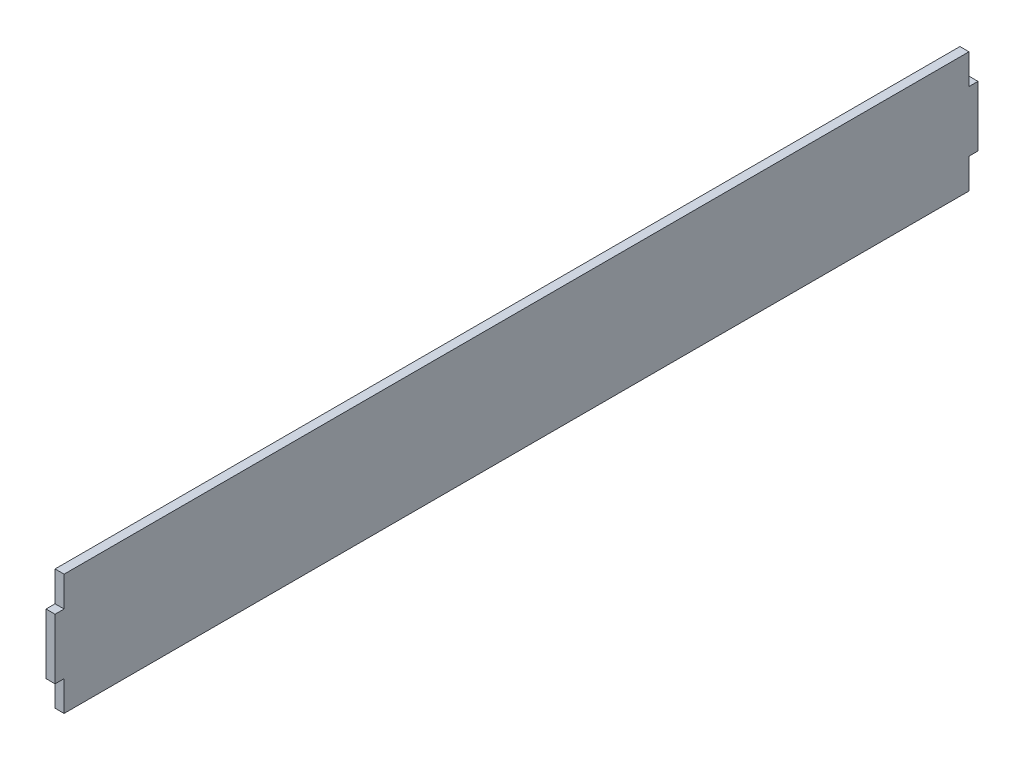
ISO-10303-21;
HEADER;
FILE_DESCRIPTION(('STEP AP214'),'2;1');
FILE_NAME('part.step','',(''),(''),'','','');
FILE_SCHEMA(('AUTOMOTIVE_DESIGN { 1 0 10303 214 1 1 1 1 }'));
ENDSEC;
DATA;
#1=APPLICATION_CONTEXT('core data for automotive mechanical design processes');
#2=APPLICATION_PROTOCOL_DEFINITION('international standard','automotive_design',2000,#1);
#3=PRODUCT_CONTEXT('',#1,'mechanical');
#4=PRODUCT('Part','Part','',(#3));
#5=PRODUCT_RELATED_PRODUCT_CATEGORY('part','',(#4));
#6=PRODUCT_DEFINITION_FORMATION('','',#4);
#7=PRODUCT_DEFINITION_CONTEXT('part definition',#1,'design');
#8=PRODUCT_DEFINITION('design','',#6,#7);
#9=PRODUCT_DEFINITION_SHAPE('','',#8);
#10=(LENGTH_UNIT() NAMED_UNIT(*) SI_UNIT(.MILLI.,.METRE.));
#11=(NAMED_UNIT(*) PLANE_ANGLE_UNIT() SI_UNIT($,.RADIAN.));
#12=(NAMED_UNIT(*) SI_UNIT($,.STERADIAN.) SOLID_ANGLE_UNIT());
#13=UNCERTAINTY_MEASURE_WITH_UNIT(LENGTH_MEASURE(1.E-05),#10,'distance_accuracy_value','');
#14=(GEOMETRIC_REPRESENTATION_CONTEXT(3) GLOBAL_UNCERTAINTY_ASSIGNED_CONTEXT((#13)) GLOBAL_UNIT_ASSIGNED_CONTEXT((#10,
#11,#12)) REPRESENTATION_CONTEXT('',''));
#15=CARTESIAN_POINT('',(0.,0.,0.));
#16=DIRECTION('',(0.,0.,1.));
#17=DIRECTION('',(1.,0.,0.));
#18=AXIS2_PLACEMENT_3D('',#15,#16,#17);
#19=CARTESIAN_POINT('',(3.,48.93917980812,176.195672358896));
#20=DIRECTION('',(0.,0.,-1.));
#21=DIRECTION('',(-1.,0.,0.));
#22=AXIS2_PLACEMENT_3D('',#19,#20,#21);
#23=PLANE('',#22);
#24=DIRECTION('',(0.,-1.,0.));
#25=VECTOR('',#24,1.);
#26=CARTESIAN_POINT('',(0.,48.93917980812,176.195672358896));
#27=LINE('',#26,#25);
#28=CARTESIAN_POINT('',(0.,58.93917980812,176.195672358896));
#29=VERTEX_POINT('',#28);
#30=CARTESIAN_POINT('',(0.,48.93917980812,176.195672358896));
#31=VERTEX_POINT('',#30);
#32=EDGE_CURVE('E153',#29,#31,#27,.T.);
#33=ORIENTED_EDGE('',*,*,#32,.T.);
#34=DIRECTION('',(-1.,0.,0.));
#35=VECTOR('',#34,1.);
#36=CARTESIAN_POINT('',(3.,48.93917980812,176.195672358896));
#37=LINE('',#36,#35);
#38=CARTESIAN_POINT('',(3.,48.93917980812,176.195672358896));
#39=VERTEX_POINT('',#38);
#40=EDGE_CURVE('E11',#39,#31,#37,.T.);
#41=ORIENTED_EDGE('',*,*,#40,.F.);
#42=DIRECTION('',(0.,-1.,0.));
#43=VECTOR('',#42,1.);
#44=CARTESIAN_POINT('',(3.,48.93917980812,176.195672358896));
#45=LINE('',#44,#43);
#46=CARTESIAN_POINT('',(3.,58.93917980812,176.195672358896));
#47=VERTEX_POINT('',#46);
#48=EDGE_CURVE('E175',#47,#39,#45,.T.);
#49=ORIENTED_EDGE('',*,*,#48,.F.);
#50=DIRECTION('',(-1.,0.,0.));
#51=VECTOR('',#50,1.);
#52=CARTESIAN_POINT('',(3.,58.93917980812,176.195672358896));
#53=LINE('',#52,#51);
#54=EDGE_CURVE('E149',#47,#29,#53,.T.);
#55=ORIENTED_EDGE('',*,*,#54,.T.);
#56=EDGE_LOOP('',(#33,#41,#49,#55));
#57=FACE_BOUND('',#56,.T.);
#58=ADVANCED_FACE('F33',(#57),#23,.F.);
#59=CARTESIAN_POINT('',(3.,48.93917980812,179.195672358896));
#60=DIRECTION('',(0.,-1.,0.));
#61=DIRECTION('',(0.,0.,-1.));
#62=AXIS2_PLACEMENT_3D('',#59,#60,#61);
#63=PLANE('',#62);
#64=DIRECTION('',(0.,0.,1.));
#65=VECTOR('',#64,1.);
#66=CARTESIAN_POINT('',(0.,48.93917980812,179.195672358896));
#67=LINE('',#66,#65);
#68=CARTESIAN_POINT('',(0.,48.93917980812,179.195672358896));
#69=VERTEX_POINT('',#68);
#70=EDGE_CURVE('E156',#31,#69,#67,.T.);
#71=ORIENTED_EDGE('',*,*,#70,.T.);
#72=DIRECTION('',(-1.,0.,0.));
#73=VECTOR('',#72,1.);
#74=CARTESIAN_POINT('',(3.,48.93917980812,179.195672358896));
#75=LINE('',#74,#73);
#76=CARTESIAN_POINT('',(3.,48.93917980812,179.195672358896));
#77=VERTEX_POINT('',#76);
#78=EDGE_CURVE('E41',#77,#69,#75,.T.);
#79=ORIENTED_EDGE('',*,*,#78,.F.);
#80=DIRECTION('',(0.,0.,1.));
#81=VECTOR('',#80,1.);
#82=CARTESIAN_POINT('',(3.,48.93917980812,179.195672358896));
#83=LINE('',#82,#81);
#84=EDGE_CURVE('E104',#39,#77,#83,.T.);
#85=ORIENTED_EDGE('',*,*,#84,.F.);
#86=ORIENTED_EDGE('',*,*,#40,.T.);
#87=EDGE_LOOP('',(#71,#79,#85,#86));
#88=FACE_BOUND('',#87,.T.);
#89=ADVANCED_FACE('F253',(#88),#63,.F.);
#90=CARTESIAN_POINT('',(3.,28.9391798081199,179.195672358896));
#91=DIRECTION('',(0.,0.,-1.));
#92=DIRECTION('',(-1.,0.,0.));
#93=AXIS2_PLACEMENT_3D('',#90,#91,#92);
#94=PLANE('',#93);
#95=DIRECTION('',(0.,-1.,0.));
#96=VECTOR('',#95,1.);
#97=CARTESIAN_POINT('',(0.,28.9391798081199,179.195672358896));
#98=LINE('',#97,#96);
#99=CARTESIAN_POINT('',(0.,28.9391798081199,179.195672358896));
#100=VERTEX_POINT('',#99);
#101=EDGE_CURVE('E158',#69,#100,#98,.T.);
#102=ORIENTED_EDGE('',*,*,#101,.T.);
#103=DIRECTION('',(-1.,0.,0.));
#104=VECTOR('',#103,1.);
#105=CARTESIAN_POINT('',(3.,28.9391798081199,179.195672358896));
#106=LINE('',#105,#104);
#107=CARTESIAN_POINT('',(3.,28.9391798081199,179.195672358896));
#108=VERTEX_POINT('',#107);
#109=EDGE_CURVE('E194',#108,#100,#106,.T.);
#110=ORIENTED_EDGE('',*,*,#109,.F.);
#111=DIRECTION('',(0.,-1.,0.));
#112=VECTOR('',#111,1.);
#113=CARTESIAN_POINT('',(3.,28.9391798081199,179.195672358896));
#114=LINE('',#113,#112);
#115=EDGE_CURVE('E202',#77,#108,#114,.T.);
#116=ORIENTED_EDGE('',*,*,#115,.F.);
#117=ORIENTED_EDGE('',*,*,#78,.T.);
#118=EDGE_LOOP('',(#102,#110,#116,#117));
#119=FACE_BOUND('',#118,.T.);
#120=ADVANCED_FACE('F200',(#119),#94,.F.);
#121=CARTESIAN_POINT('',(3.,28.9391798081199,176.195672358896));
#122=DIRECTION('',(0.,1.,0.));
#123=DIRECTION('',(0.,0.,1.));
#124=AXIS2_PLACEMENT_3D('',#121,#122,#123);
#125=PLANE('',#124);
#126=DIRECTION('',(0.,0.,-1.));
#127=VECTOR('',#126,1.);
#128=CARTESIAN_POINT('',(0.,28.9391798081199,176.195672358896));
#129=LINE('',#128,#127);
#130=CARTESIAN_POINT('',(0.,28.9391798081199,176.195672358896));
#131=VERTEX_POINT('',#130);
#132=EDGE_CURVE('E160',#100,#131,#129,.T.);
#133=ORIENTED_EDGE('',*,*,#132,.T.);
#134=DIRECTION('',(-1.,0.,0.));
#135=VECTOR('',#134,1.);
#136=CARTESIAN_POINT('',(3.,28.9391798081199,176.195672358896));
#137=LINE('',#136,#135);
#138=CARTESIAN_POINT('',(3.,28.9391798081199,176.195672358896));
#139=VERTEX_POINT('',#138);
#140=EDGE_CURVE('E191',#139,#131,#137,.T.);
#141=ORIENTED_EDGE('',*,*,#140,.F.);
#142=DIRECTION('',(0.,0.,-1.));
#143=VECTOR('',#142,1.);
#144=CARTESIAN_POINT('',(3.,28.9391798081199,176.195672358896));
#145=LINE('',#144,#143);
#146=EDGE_CURVE('E220',#108,#139,#145,.T.);
#147=ORIENTED_EDGE('',*,*,#146,.F.);
#148=ORIENTED_EDGE('',*,*,#109,.T.);
#149=EDGE_LOOP('',(#133,#141,#147,#148));
#150=FACE_BOUND('',#149,.T.);
#151=ADVANCED_FACE('F211',(#150),#125,.F.);
#152=CARTESIAN_POINT('',(3.,18.9391798081199,176.195672358896));
#153=DIRECTION('',(0.,0.,-1.));
#154=DIRECTION('',(-1.,0.,0.));
#155=AXIS2_PLACEMENT_3D('',#152,#153,#154);
#156=PLANE('',#155);
#157=DIRECTION('',(0.,-1.,0.));
#158=VECTOR('',#157,1.);
#159=CARTESIAN_POINT('',(0.,18.9391798081199,176.195672358896));
#160=LINE('',#159,#158);
#161=CARTESIAN_POINT('',(0.,18.9391798081199,176.195672358896));
#162=VERTEX_POINT('',#161);
#163=EDGE_CURVE('E162',#131,#162,#160,.T.);
#164=ORIENTED_EDGE('',*,*,#163,.T.);
#165=DIRECTION('',(-1.,0.,0.));
#166=VECTOR('',#165,1.);
#167=CARTESIAN_POINT('',(3.,18.9391798081199,176.195672358896));
#168=LINE('',#167,#166);
#169=CARTESIAN_POINT('',(3.,18.9391798081199,176.195672358896));
#170=VERTEX_POINT('',#169);
#171=EDGE_CURVE('E188',#170,#162,#168,.T.);
#172=ORIENTED_EDGE('',*,*,#171,.F.);
#173=DIRECTION('',(0.,-1.,0.));
#174=VECTOR('',#173,1.);
#175=CARTESIAN_POINT('',(3.,18.9391798081199,176.195672358896));
#176=LINE('',#175,#174);
#177=EDGE_CURVE('E217',#139,#170,#176,.T.);
#178=ORIENTED_EDGE('',*,*,#177,.F.);
#179=ORIENTED_EDGE('',*,*,#140,.T.);
#180=EDGE_LOOP('',(#164,#172,#178,#179));
#181=FACE_BOUND('',#180,.T.);
#182=ADVANCED_FACE('F215',(#181),#156,.F.);
#183=CARTESIAN_POINT('',(3.,18.9391798081199,-123.804327641104));
#184=DIRECTION('',(0.,1.,0.));
#185=DIRECTION('',(0.,0.,1.));
#186=AXIS2_PLACEMENT_3D('',#183,#184,#185);
#187=PLANE('',#186);
#188=DIRECTION('',(0.,0.,-1.));
#189=VECTOR('',#188,1.);
#190=CARTESIAN_POINT('',(0.,18.9391798081199,-123.804327641104));
#191=LINE('',#190,#189);
#192=CARTESIAN_POINT('',(0.,18.9391798081199,-123.804327641104));
#193=VERTEX_POINT('',#192);
#194=EDGE_CURVE('E164',#162,#193,#191,.T.);
#195=ORIENTED_EDGE('',*,*,#194,.T.);
#196=DIRECTION('',(-1.,0.,0.));
#197=VECTOR('',#196,1.);
#198=CARTESIAN_POINT('',(3.,18.9391798081199,-123.804327641104));
#199=LINE('',#198,#197);
#200=CARTESIAN_POINT('',(3.,18.9391798081199,-123.804327641104));
#201=VERTEX_POINT('',#200);
#202=EDGE_CURVE('E185',#201,#193,#199,.T.);
#203=ORIENTED_EDGE('',*,*,#202,.F.);
#204=DIRECTION('',(0.,0.,-1.));
#205=VECTOR('',#204,1.);
#206=CARTESIAN_POINT('',(3.,18.9391798081199,-123.804327641104));
#207=LINE('',#206,#205);
#208=EDGE_CURVE('E219',#170,#201,#207,.T.);
#209=ORIENTED_EDGE('',*,*,#208,.F.);
#210=ORIENTED_EDGE('',*,*,#171,.T.);
#211=EDGE_LOOP('',(#195,#203,#209,#210));
#212=FACE_BOUND('',#211,.T.);
#213=ADVANCED_FACE('F266',(#212),#187,.F.);
#214=CARTESIAN_POINT('',(3.,28.9391798081199,-123.804327641104));
#215=DIRECTION('',(0.,0.,1.));
#216=DIRECTION('',(1.,0.,0.));
#217=AXIS2_PLACEMENT_3D('',#214,#215,#216);
#218=PLANE('',#217);
#219=DIRECTION('',(0.,1.,0.));
#220=VECTOR('',#219,1.);
#221=CARTESIAN_POINT('',(0.,28.9391798081199,-123.804327641104));
#222=LINE('',#221,#220);
#223=CARTESIAN_POINT('',(0.,28.9391798081199,-123.804327641104));
#224=VERTEX_POINT('',#223);
#225=EDGE_CURVE('E166',#193,#224,#222,.T.);
#226=ORIENTED_EDGE('',*,*,#225,.T.);
#227=DIRECTION('',(-1.,0.,0.));
#228=VECTOR('',#227,1.);
#229=CARTESIAN_POINT('',(3.,28.9391798081199,-123.804327641104));
#230=LINE('',#229,#228);
#231=CARTESIAN_POINT('',(3.,28.9391798081199,-123.804327641104));
#232=VERTEX_POINT('',#231);
#233=EDGE_CURVE('E182',#232,#224,#230,.T.);
#234=ORIENTED_EDGE('',*,*,#233,.F.);
#235=DIRECTION('',(0.,1.,0.));
#236=VECTOR('',#235,1.);
#237=CARTESIAN_POINT('',(3.,28.9391798081199,-123.804327641104));
#238=LINE('',#237,#236);
#239=EDGE_CURVE('E222',#201,#232,#238,.T.);
#240=ORIENTED_EDGE('',*,*,#239,.F.);
#241=ORIENTED_EDGE('',*,*,#202,.T.);
#242=EDGE_LOOP('',(#226,#234,#240,#241));
#243=FACE_BOUND('',#242,.T.);
#244=ADVANCED_FACE('F269',(#243),#218,.F.);
#245=CARTESIAN_POINT('',(3.,28.9391798081199,-126.804327641104));
#246=DIRECTION('',(0.,1.,0.));
#247=DIRECTION('',(0.,0.,1.));
#248=AXIS2_PLACEMENT_3D('',#245,#246,#247);
#249=PLANE('',#248);
#250=DIRECTION('',(0.,0.,-1.));
#251=VECTOR('',#250,1.);
#252=CARTESIAN_POINT('',(0.,28.9391798081199,-126.804327641104));
#253=LINE('',#252,#251);
#254=CARTESIAN_POINT('',(0.,28.9391798081199,-126.804327641104));
#255=VERTEX_POINT('',#254);
#256=EDGE_CURVE('E168',#224,#255,#253,.T.);
#257=ORIENTED_EDGE('',*,*,#256,.T.);
#258=DIRECTION('',(-1.,0.,0.));
#259=VECTOR('',#258,1.);
#260=CARTESIAN_POINT('',(3.,28.9391798081199,-126.804327641104));
#261=LINE('',#260,#259);
#262=CARTESIAN_POINT('',(3.,28.9391798081199,-126.804327641104));
#263=VERTEX_POINT('',#262);
#264=EDGE_CURVE('E179',#263,#255,#261,.T.);
#265=ORIENTED_EDGE('',*,*,#264,.F.);
#266=DIRECTION('',(0.,0.,-1.));
#267=VECTOR('',#266,1.);
#268=CARTESIAN_POINT('',(3.,28.9391798081199,-126.804327641104));
#269=LINE('',#268,#267);
#270=EDGE_CURVE('E228',#232,#263,#269,.T.);
#271=ORIENTED_EDGE('',*,*,#270,.F.);
#272=ORIENTED_EDGE('',*,*,#233,.T.);
#273=EDGE_LOOP('',(#257,#265,#271,#272));
#274=FACE_BOUND('',#273,.T.);
#275=ADVANCED_FACE('F234',(#274),#249,.F.);
#276=CARTESIAN_POINT('',(3.,48.9391798081199,-126.804327641104));
#277=DIRECTION('',(0.,0.,1.));
#278=DIRECTION('',(1.,0.,0.));
#279=AXIS2_PLACEMENT_3D('',#276,#277,#278);
#280=PLANE('',#279);
#281=DIRECTION('',(0.,1.,0.));
#282=VECTOR('',#281,1.);
#283=CARTESIAN_POINT('',(0.,48.9391798081199,-126.804327641104));
#284=LINE('',#283,#282);
#285=CARTESIAN_POINT('',(0.,48.9391798081199,-126.804327641104));
#286=VERTEX_POINT('',#285);
#287=EDGE_CURVE('E170',#255,#286,#284,.T.);
#288=ORIENTED_EDGE('',*,*,#287,.T.);
#289=DIRECTION('',(-1.,0.,0.));
#290=VECTOR('',#289,1.);
#291=CARTESIAN_POINT('',(3.,48.9391798081199,-126.804327641104));
#292=LINE('',#291,#290);
#293=CARTESIAN_POINT('',(3.,48.9391798081199,-126.804327641104));
#294=VERTEX_POINT('',#293);
#295=EDGE_CURVE('E144',#294,#286,#292,.T.);
#296=ORIENTED_EDGE('',*,*,#295,.F.);
#297=DIRECTION('',(0.,1.,0.));
#298=VECTOR('',#297,1.);
#299=CARTESIAN_POINT('',(3.,48.9391798081199,-126.804327641104));
#300=LINE('',#299,#298);
#301=EDGE_CURVE('E135',#263,#294,#300,.T.);
#302=ORIENTED_EDGE('',*,*,#301,.F.);
#303=ORIENTED_EDGE('',*,*,#264,.T.);
#304=EDGE_LOOP('',(#288,#296,#302,#303));
#305=FACE_BOUND('',#304,.T.);
#306=ADVANCED_FACE('F238',(#305),#280,.F.);
#307=CARTESIAN_POINT('',(3.,48.93917980812,-123.804327641104));
#308=DIRECTION('',(0.,-1.,0.));
#309=DIRECTION('',(0.,0.,-1.));
#310=AXIS2_PLACEMENT_3D('',#307,#308,#309);
#311=PLANE('',#310);
#312=DIRECTION('',(0.,0.,1.));
#313=VECTOR('',#312,1.);
#314=CARTESIAN_POINT('',(0.,48.93917980812,-123.804327641104));
#315=LINE('',#314,#313);
#316=CARTESIAN_POINT('',(0.,48.93917980812,-123.804327641104));
#317=VERTEX_POINT('',#316);
#318=EDGE_CURVE('E143',#286,#317,#315,.T.);
#319=ORIENTED_EDGE('',*,*,#318,.T.);
#320=DIRECTION('',(-1.,0.,0.));
#321=VECTOR('',#320,1.);
#322=CARTESIAN_POINT('',(3.,48.93917980812,-123.804327641104));
#323=LINE('',#322,#321);
#324=CARTESIAN_POINT('',(3.,48.93917980812,-123.804327641104));
#325=VERTEX_POINT('',#324);
#326=EDGE_CURVE('E140',#325,#317,#323,.T.);
#327=ORIENTED_EDGE('',*,*,#326,.F.);
#328=DIRECTION('',(0.,0.,1.));
#329=VECTOR('',#328,1.);
#330=CARTESIAN_POINT('',(3.,48.93917980812,-123.804327641104));
#331=LINE('',#330,#329);
#332=EDGE_CURVE('E129',#294,#325,#331,.T.);
#333=ORIENTED_EDGE('',*,*,#332,.F.);
#334=ORIENTED_EDGE('',*,*,#295,.T.);
#335=EDGE_LOOP('',(#319,#327,#333,#334));
#336=FACE_BOUND('',#335,.T.);
#337=ADVANCED_FACE('F141',(#336),#311,.F.);
#338=CARTESIAN_POINT('',(3.,58.93917980812,-123.804327641104));
#339=DIRECTION('',(0.,0.,1.));
#340=DIRECTION('',(1.,0.,0.));
#341=AXIS2_PLACEMENT_3D('',#338,#339,#340);
#342=PLANE('',#341);
#343=DIRECTION('',(0.,1.,0.));
#344=VECTOR('',#343,1.);
#345=CARTESIAN_POINT('',(0.,58.93917980812,-123.804327641104));
#346=LINE('',#345,#344);
#347=CARTESIAN_POINT('',(0.,58.93917980812,-123.804327641104));
#348=VERTEX_POINT('',#347);
#349=EDGE_CURVE('E90',#317,#348,#346,.T.);
#350=ORIENTED_EDGE('',*,*,#349,.T.);
#351=DIRECTION('',(-1.,0.,0.));
#352=VECTOR('',#351,1.);
#353=CARTESIAN_POINT('',(3.,58.93917980812,-123.804327641104));
#354=LINE('',#353,#352);
#355=CARTESIAN_POINT('',(3.,58.93917980812,-123.804327641104));
#356=VERTEX_POINT('',#355);
#357=EDGE_CURVE('E145',#356,#348,#354,.T.);
#358=ORIENTED_EDGE('',*,*,#357,.F.);
#359=DIRECTION('',(0.,1.,0.));
#360=VECTOR('',#359,1.);
#361=CARTESIAN_POINT('',(3.,58.93917980812,-123.804327641104));
#362=LINE('',#361,#360);
#363=EDGE_CURVE('E133',#325,#356,#362,.T.);
#364=ORIENTED_EDGE('',*,*,#363,.F.);
#365=ORIENTED_EDGE('',*,*,#326,.T.);
#366=EDGE_LOOP('',(#350,#358,#364,#365));
#367=FACE_BOUND('',#366,.T.);
#368=ADVANCED_FACE('F147',(#367),#342,.F.);
#369=CARTESIAN_POINT('',(3.,58.93917980812,176.195672358896));
#370=DIRECTION('',(0.,-1.,0.));
#371=DIRECTION('',(0.,0.,-1.));
#372=AXIS2_PLACEMENT_3D('',#369,#370,#371);
#373=PLANE('',#372);
#374=DIRECTION('',(0.,0.,1.));
#375=VECTOR('',#374,1.);
#376=CARTESIAN_POINT('',(0.,58.93917980812,176.195672358896));
#377=LINE('',#376,#375);
#378=EDGE_CURVE('E96',#348,#29,#377,.T.);
#379=ORIENTED_EDGE('',*,*,#378,.T.);
#380=ORIENTED_EDGE('',*,*,#54,.F.);
#381=DIRECTION('',(0.,0.,1.));
#382=VECTOR('',#381,1.);
#383=CARTESIAN_POINT('',(3.,58.93917980812,176.195672358896));
#384=LINE('',#383,#382);
#385=EDGE_CURVE('E49',#356,#47,#384,.T.);
#386=ORIENTED_EDGE('',*,*,#385,.F.);
#387=ORIENTED_EDGE('',*,*,#357,.T.);
#388=EDGE_LOOP('',(#379,#380,#386,#387));
#389=FACE_BOUND('',#388,.T.);
#390=ADVANCED_FACE('F242',(#389),#373,.F.);
#391=CARTESIAN_POINT('',(3.,0.,0.));
#392=DIRECTION('',(-1.,0.,0.));
#393=DIRECTION('',(0.,0.,1.));
#394=AXIS2_PLACEMENT_3D('',#391,#392,#393);
#395=PLANE('',#394);
#396=ORIENTED_EDGE('',*,*,#48,.T.);
#397=ORIENTED_EDGE('',*,*,#84,.T.);
#398=ORIENTED_EDGE('',*,*,#115,.T.);
#399=ORIENTED_EDGE('',*,*,#146,.T.);
#400=ORIENTED_EDGE('',*,*,#177,.T.);
#401=ORIENTED_EDGE('',*,*,#208,.T.);
#402=ORIENTED_EDGE('',*,*,#239,.T.);
#403=ORIENTED_EDGE('',*,*,#270,.T.);
#404=ORIENTED_EDGE('',*,*,#301,.T.);
#405=ORIENTED_EDGE('',*,*,#332,.T.);
#406=ORIENTED_EDGE('',*,*,#363,.T.);
#407=ORIENTED_EDGE('',*,*,#385,.T.);
#408=EDGE_LOOP('',(#396,#397,#398,#399,#400,#401,#402,#403,#404,#405,#406,#407));
#409=FACE_BOUND('',#408,.T.);
#410=ADVANCED_FACE('F131',(#409),#395,.F.);
#411=CARTESIAN_POINT('',(0.,0.,0.));
#412=DIRECTION('',(-1.,0.,0.));
#413=DIRECTION('',(0.,0.,1.));
#414=AXIS2_PLACEMENT_3D('',#411,#412,#413);
#415=PLANE('',#414);
#416=ORIENTED_EDGE('',*,*,#32,.F.);
#417=ORIENTED_EDGE('',*,*,#378,.F.);
#418=ORIENTED_EDGE('',*,*,#349,.F.);
#419=ORIENTED_EDGE('',*,*,#318,.F.);
#420=ORIENTED_EDGE('',*,*,#287,.F.);
#421=ORIENTED_EDGE('',*,*,#256,.F.);
#422=ORIENTED_EDGE('',*,*,#225,.F.);
#423=ORIENTED_EDGE('',*,*,#194,.F.);
#424=ORIENTED_EDGE('',*,*,#163,.F.);
#425=ORIENTED_EDGE('',*,*,#132,.F.);
#426=ORIENTED_EDGE('',*,*,#101,.F.);
#427=ORIENTED_EDGE('',*,*,#70,.F.);
#428=EDGE_LOOP('',(#416,#417,#418,#419,#420,#421,#422,#423,#424,#425,#426,#427));
#429=FACE_BOUND('',#428,.T.);
#430=ADVANCED_FACE('F206',(#429),#415,.T.);
#431=CLOSED_SHELL('',(#58,#89,#120,#151,#182,#213,#244,#275,#306,#337,#368,#390,#410,#430));
#432=MANIFOLD_SOLID_BREP('B2',#431);
#433=ADVANCED_BREP_SHAPE_REPRESENTATION('',(#18,#432),#14);
#434=SHAPE_DEFINITION_REPRESENTATION(#9,#433);
ENDSEC;
END-ISO-10303-21;
